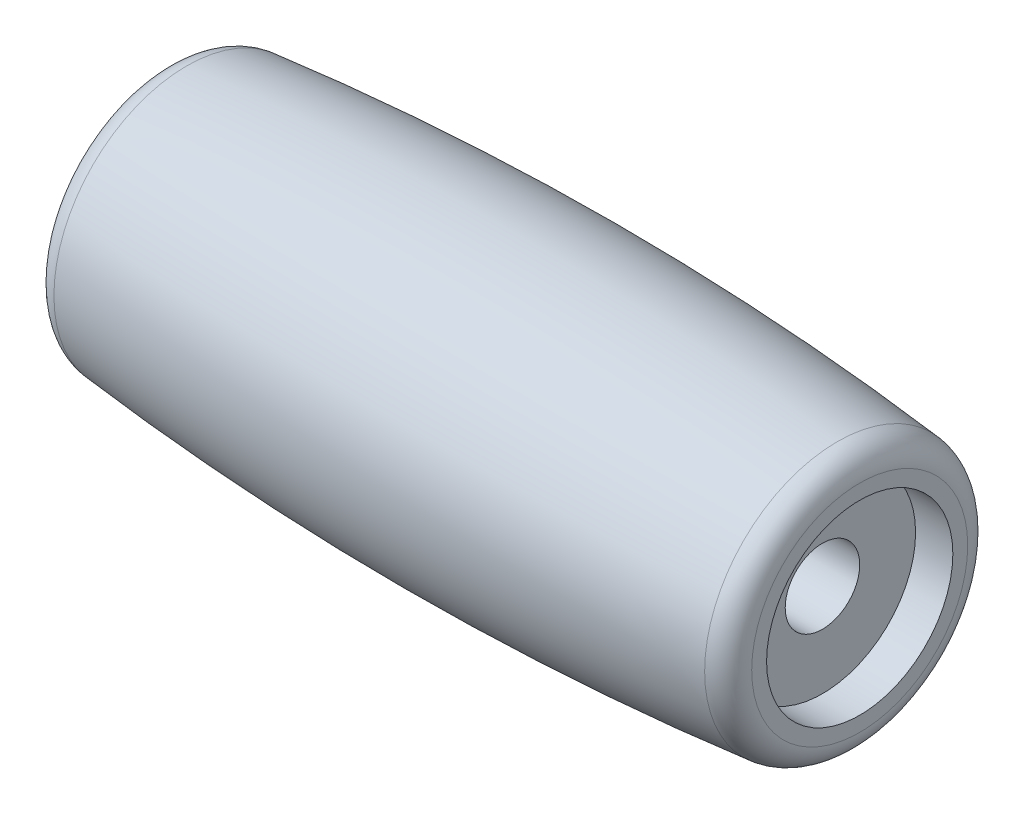
ISO-10303-21;
HEADER;
FILE_DESCRIPTION(('STEP AP214'),'2;1');
FILE_NAME('part.step','',(''),(''),'','','');
FILE_SCHEMA(('AUTOMOTIVE_DESIGN { 1 0 10303 214 1 1 1 1 }'));
ENDSEC;
DATA;
#1=APPLICATION_CONTEXT('core data for automotive mechanical design processes');
#2=APPLICATION_PROTOCOL_DEFINITION('international standard','automotive_design',2000,#1);
#3=PRODUCT_CONTEXT('',#1,'mechanical');
#4=PRODUCT('Part','Part','',(#3));
#5=PRODUCT_RELATED_PRODUCT_CATEGORY('part','',(#4));
#6=PRODUCT_DEFINITION_FORMATION('','',#4);
#7=PRODUCT_DEFINITION_CONTEXT('part definition',#1,'design');
#8=PRODUCT_DEFINITION('design','',#6,#7);
#9=PRODUCT_DEFINITION_SHAPE('','',#8);
#10=(LENGTH_UNIT() NAMED_UNIT(*) SI_UNIT(.MILLI.,.METRE.));
#11=(NAMED_UNIT(*) PLANE_ANGLE_UNIT() SI_UNIT($,.RADIAN.));
#12=(NAMED_UNIT(*) SI_UNIT($,.STERADIAN.) SOLID_ANGLE_UNIT());
#13=UNCERTAINTY_MEASURE_WITH_UNIT(LENGTH_MEASURE(1.E-05),#10,'distance_accuracy_value','');
#14=(GEOMETRIC_REPRESENTATION_CONTEXT(3) GLOBAL_UNCERTAINTY_ASSIGNED_CONTEXT((#13)) GLOBAL_UNIT_ASSIGNED_CONTEXT((#10,
#11,#12)) REPRESENTATION_CONTEXT('',''));
#15=CARTESIAN_POINT('',(0.,0.,0.));
#16=DIRECTION('',(0.,0.,1.));
#17=DIRECTION('',(1.,0.,0.));
#18=AXIS2_PLACEMENT_3D('',#15,#16,#17);
#19=CARTESIAN_POINT('',(12.5,1.5,0.));
#20=DIRECTION('',(-1.,0.,0.));
#21=DIRECTION('',(0.,0.,1.));
#22=AXIS2_PLACEMENT_3D('',#19,#20,#21);
#23=PLANE('',#22);
#24=CARTESIAN_POINT('',(12.5,0.,0.));
#25=DIRECTION('',(-1.,0.,0.));
#26=DIRECTION('',(0.,0.,1.));
#27=AXIS2_PLACEMENT_3D('',#24,#25,#26);
#28=CIRCLE('',#27,3.75);
#29=CARTESIAN_POINT('',(12.5,0.,3.75));
#30=VERTEX_POINT('',#29);
#31=EDGE_CURVE('E10',#30,#30,#28,.T.);
#32=ORIENTED_EDGE('',*,*,#31,.F.);
#33=EDGE_LOOP('',(#32));
#34=FACE_BOUND('',#33,.T.);
#35=CARTESIAN_POINT('',(12.5,0.,0.));
#36=DIRECTION('',(-1.,0.,0.));
#37=DIRECTION('',(0.,0.,1.));
#38=AXIS2_PLACEMENT_3D('',#35,#36,#37);
#39=CIRCLE('',#38,1.5);
#40=CARTESIAN_POINT('',(12.5,0.,1.5));
#41=VERTEX_POINT('',#40);
#42=EDGE_CURVE('E66',#41,#41,#39,.T.);
#43=ORIENTED_EDGE('',*,*,#42,.T.);
#44=EDGE_LOOP('',(#43));
#45=FACE_BOUND('',#44,.T.);
#46=ADVANCED_FACE('F32',(#34,#45),#23,.F.);
#47=CARTESIAN_POINT('',(0.,0.,0.));
#48=DIRECTION('',(-1.,0.,0.));
#49=DIRECTION('',(0.,0.,1.));
#50=AXIS2_PLACEMENT_3D('',#47,#48,#49);
#51=CYLINDRICAL_SURFACE('',#50,3.75);
#52=CARTESIAN_POINT('',(14.,0.,0.));
#53=DIRECTION('',(-1.,0.,0.));
#54=DIRECTION('',(0.,0.,1.));
#55=AXIS2_PLACEMENT_3D('',#52,#53,#54);
#56=CIRCLE('',#55,3.75);
#57=CARTESIAN_POINT('',(14.,0.,3.75));
#58=VERTEX_POINT('',#57);
#59=EDGE_CURVE('E38',#58,#58,#56,.T.);
#60=ORIENTED_EDGE('',*,*,#59,.F.);
#61=EDGE_LOOP('',(#60));
#62=FACE_BOUND('',#61,.T.);
#63=ORIENTED_EDGE('',*,*,#31,.T.);
#64=EDGE_LOOP('',(#63));
#65=FACE_BOUND('',#64,.T.);
#66=ADVANCED_FACE('F115',(#62,#65),#51,.F.);
#67=CARTESIAN_POINT('',(14.,3.75,0.));
#68=DIRECTION('',(-1.,0.,0.));
#69=DIRECTION('',(0.,0.,1.));
#70=AXIS2_PLACEMENT_3D('',#67,#68,#69);
#71=PLANE('',#70);
#72=CARTESIAN_POINT('',(14.,0.,0.));
#73=DIRECTION('',(-1.,0.,0.));
#74=DIRECTION('',(0.,0.,1.));
#75=AXIS2_PLACEMENT_3D('',#72,#73,#74);
#76=CIRCLE('',#75,4.34857666506388);
#77=CARTESIAN_POINT('',(14.,0.,4.34857666506388));
#78=VERTEX_POINT('',#77);
#79=EDGE_CURVE('E42',#78,#78,#76,.T.);
#80=ORIENTED_EDGE('',*,*,#79,.F.);
#81=EDGE_LOOP('',(#80));
#82=FACE_BOUND('',#81,.T.);
#83=ORIENTED_EDGE('',*,*,#59,.T.);
#84=EDGE_LOOP('',(#83));
#85=FACE_BOUND('',#84,.T.);
#86=ADVANCED_FACE('F110',(#82,#85),#71,.F.);
#87=CARTESIAN_POINT('',(13.,0.,0.));
#88=DIRECTION('',(-1.,0.,0.));
#89=DIRECTION('',(0.,0.,1.));
#90=AXIS2_PLACEMENT_3D('',#87,#88,#89);
#91=TOROIDAL_SURFACE('',#90,4.34857666506388,1.00000000000001);
#92=CARTESIAN_POINT('',(13.0999679589875,0.,0.));
#93=DIRECTION('',(-1.,0.,0.));
#94=DIRECTION('',(0.,0.,1.));
#95=AXIS2_PLACEMENT_3D('',#92,#93,#94);
#96=CIRCLE('',#95,5.34356732189231);
#97=CARTESIAN_POINT('',(13.0999679589875,0.,5.34356732189231));
#98=VERTEX_POINT('',#97);
#99=EDGE_CURVE('E46',#98,#98,#96,.T.);
#100=ORIENTED_EDGE('',*,*,#99,.F.);
#101=EDGE_LOOP('',(#100));
#102=FACE_BOUND('',#101,.T.);
#103=ORIENTED_EDGE('',*,*,#79,.T.);
#104=EDGE_LOOP('',(#103));
#105=FACE_BOUND('',#104,.T.);
#106=ADVANCED_FACE('F104',(#102,#105),#91,.T.);
#107=CARTESIAN_POINT('',(0.,0.,0.));
#108=DIRECTION('',(-1.,0.,0.));
#109=DIRECTION('',(0.,0.,1.));
#110=AXIS2_PLACEMENT_3D('',#107,#108,#109);
#111=DEGENERATE_TOROIDAL_SURFACE('',#110,125.041666666666,131.041666666666,.F.);
#112=CARTESIAN_POINT('',(-13.0999679589875,0.,0.));
#113=DIRECTION('',(-1.,0.,0.));
#114=DIRECTION('',(0.,0.,1.));
#115=AXIS2_PLACEMENT_3D('',#112,#113,#114);
#116=CIRCLE('',#115,5.34356732189235);
#117=CARTESIAN_POINT('',(-13.0999679589875,0.,5.34356732189235));
#118=VERTEX_POINT('',#117);
#119=EDGE_CURVE('E51',#118,#118,#116,.T.);
#120=ORIENTED_EDGE('',*,*,#119,.F.);
#121=EDGE_LOOP('',(#120));
#122=FACE_BOUND('',#121,.T.);
#123=ORIENTED_EDGE('',*,*,#99,.T.);
#124=EDGE_LOOP('',(#123));
#125=FACE_BOUND('',#124,.T.);
#126=ADVANCED_FACE('F98',(#122,#125),#111,.F.);
#127=CARTESIAN_POINT('',(-13.,0.,0.));
#128=DIRECTION('',(-1.,0.,0.));
#129=DIRECTION('',(0.,0.,1.));
#130=AXIS2_PLACEMENT_3D('',#127,#128,#129);
#131=TOROIDAL_SURFACE('',#130,4.34857666506391,1.00000000000001);
#132=CARTESIAN_POINT('',(-14.,0.,0.));
#133=DIRECTION('',(-1.,0.,0.));
#134=DIRECTION('',(0.,0.,1.));
#135=AXIS2_PLACEMENT_3D('',#132,#133,#134);
#136=CIRCLE('',#135,4.34857666506391);
#137=CARTESIAN_POINT('',(-14.,0.,4.34857666506391));
#138=VERTEX_POINT('',#137);
#139=EDGE_CURVE('E54',#138,#138,#136,.T.);
#140=ORIENTED_EDGE('',*,*,#139,.F.);
#141=EDGE_LOOP('',(#140));
#142=FACE_BOUND('',#141,.T.);
#143=ORIENTED_EDGE('',*,*,#119,.T.);
#144=EDGE_LOOP('',(#143));
#145=FACE_BOUND('',#144,.T.);
#146=ADVANCED_FACE('F92',(#142,#145),#131,.T.);
#147=CARTESIAN_POINT('',(-14.,3.75000000000003,0.));
#148=DIRECTION('',(1.,0.,0.));
#149=DIRECTION('',(0.,0.,-1.));
#150=AXIS2_PLACEMENT_3D('',#147,#148,#149);
#151=PLANE('',#150);
#152=CARTESIAN_POINT('',(-14.,0.,0.));
#153=DIRECTION('',(-1.,0.,0.));
#154=DIRECTION('',(0.,0.,1.));
#155=AXIS2_PLACEMENT_3D('',#152,#153,#154);
#156=CIRCLE('',#155,3.75000000000003);
#157=CARTESIAN_POINT('',(-14.,0.,3.75000000000003));
#158=VERTEX_POINT('',#157);
#159=EDGE_CURVE('E57',#158,#158,#156,.T.);
#160=ORIENTED_EDGE('',*,*,#159,.F.);
#161=EDGE_LOOP('',(#160));
#162=FACE_BOUND('',#161,.T.);
#163=ORIENTED_EDGE('',*,*,#139,.T.);
#164=EDGE_LOOP('',(#163));
#165=FACE_BOUND('',#164,.T.);
#166=ADVANCED_FACE('F86',(#162,#165),#151,.F.);
#167=CARTESIAN_POINT('',(0.,0.,0.));
#168=DIRECTION('',(-1.,0.,0.));
#169=DIRECTION('',(0.,0.,1.));
#170=AXIS2_PLACEMENT_3D('',#167,#168,#169);
#171=CYLINDRICAL_SURFACE('',#170,3.75000000000003);
#172=CARTESIAN_POINT('',(-12.5,0.,0.));
#173=DIRECTION('',(-1.,0.,0.));
#174=DIRECTION('',(0.,0.,1.));
#175=AXIS2_PLACEMENT_3D('',#172,#173,#174);
#176=CIRCLE('',#175,3.75000000000003);
#177=CARTESIAN_POINT('',(-12.5,0.,3.75000000000003));
#178=VERTEX_POINT('',#177);
#179=EDGE_CURVE('E60',#178,#178,#176,.T.);
#180=ORIENTED_EDGE('',*,*,#179,.F.);
#181=EDGE_LOOP('',(#180));
#182=FACE_BOUND('',#181,.T.);
#183=ORIENTED_EDGE('',*,*,#159,.T.);
#184=EDGE_LOOP('',(#183));
#185=FACE_BOUND('',#184,.T.);
#186=ADVANCED_FACE('F80',(#182,#185),#171,.F.);
#187=CARTESIAN_POINT('',(-12.5,1.50000000000003,0.));
#188=DIRECTION('',(1.,0.,0.));
#189=DIRECTION('',(0.,0.,-1.));
#190=AXIS2_PLACEMENT_3D('',#187,#188,#189);
#191=PLANE('',#190);
#192=CARTESIAN_POINT('',(-12.5,0.,0.));
#193=DIRECTION('',(-1.,0.,0.));
#194=DIRECTION('',(0.,0.,1.));
#195=AXIS2_PLACEMENT_3D('',#192,#193,#194);
#196=CIRCLE('',#195,1.50000000000003);
#197=CARTESIAN_POINT('',(-12.5,0.,1.50000000000003));
#198=VERTEX_POINT('',#197);
#199=EDGE_CURVE('E63',#198,#198,#196,.T.);
#200=ORIENTED_EDGE('',*,*,#199,.F.);
#201=EDGE_LOOP('',(#200));
#202=FACE_BOUND('',#201,.T.);
#203=ORIENTED_EDGE('',*,*,#179,.T.);
#204=EDGE_LOOP('',(#203));
#205=FACE_BOUND('',#204,.T.);
#206=ADVANCED_FACE('F74',(#202,#205),#191,.F.);
#207=CARTESIAN_POINT('',(0.,0.,0.));
#208=DIRECTION('',(-1.,0.,0.));
#209=DIRECTION('',(0.,0.,1.));
#210=AXIS2_PLACEMENT_3D('',#207,#208,#209);
#211=CYLINDRICAL_SURFACE('',#210,1.50000000000001);
#212=ORIENTED_EDGE('',*,*,#42,.F.);
#213=EDGE_LOOP('',(#212));
#214=FACE_BOUND('',#213,.T.);
#215=ORIENTED_EDGE('',*,*,#199,.T.);
#216=EDGE_LOOP('',(#215));
#217=FACE_BOUND('',#216,.T.);
#218=ADVANCED_FACE('F71',(#214,#217),#211,.F.);
#219=CLOSED_SHELL('',(#46,#66,#86,#106,#126,#146,#166,#186,#206,#218));
#220=MANIFOLD_SOLID_BREP('B2',#219);
#221=ADVANCED_BREP_SHAPE_REPRESENTATION('',(#18,#220),#14);
#222=SHAPE_DEFINITION_REPRESENTATION(#9,#221);
ENDSEC;
END-ISO-10303-21;
